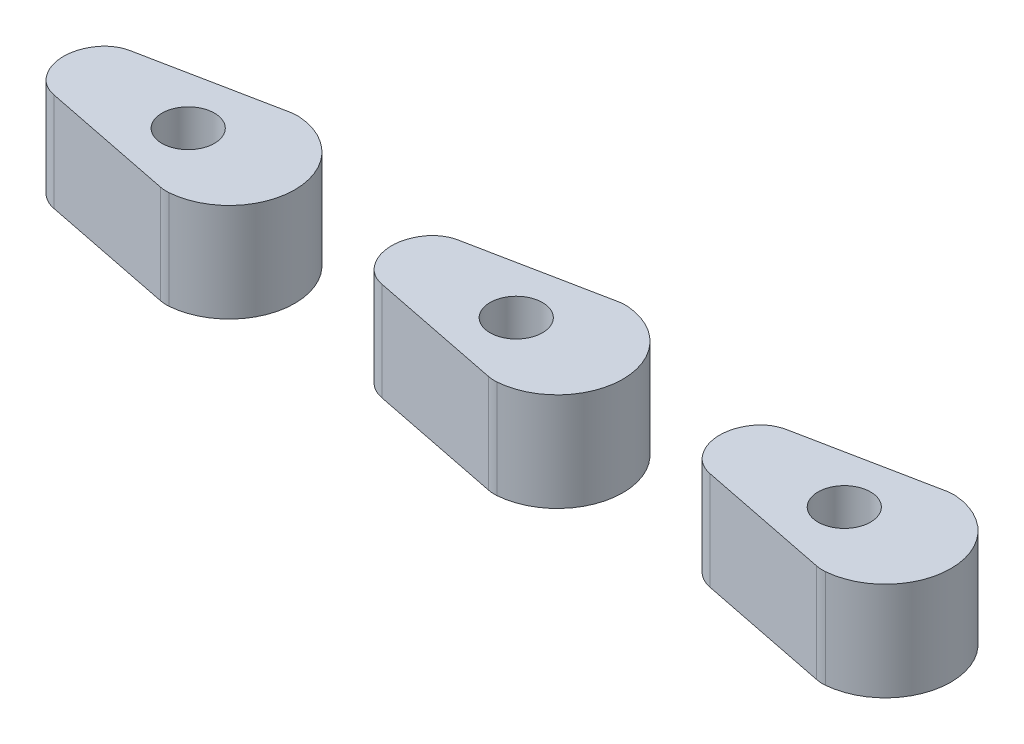
ISO-10303-21;
HEADER;
FILE_DESCRIPTION(('STEP AP214'),'2;1');
FILE_NAME('part.step','',(''),(''),'','','');
FILE_SCHEMA(('AUTOMOTIVE_DESIGN { 1 0 10303 214 1 1 1 1 }'));
ENDSEC;
DATA;
#1=APPLICATION_CONTEXT('core data for automotive mechanical design processes');
#2=APPLICATION_PROTOCOL_DEFINITION('international standard','automotive_design',2000,#1);
#3=PRODUCT_CONTEXT('',#1,'mechanical');
#4=PRODUCT('Part','Part','',(#3));
#5=PRODUCT_RELATED_PRODUCT_CATEGORY('part','',(#4));
#6=PRODUCT_DEFINITION_FORMATION('','',#4);
#7=PRODUCT_DEFINITION_CONTEXT('part definition',#1,'design');
#8=PRODUCT_DEFINITION('design','',#6,#7);
#9=PRODUCT_DEFINITION_SHAPE('','',#8);
#10=(LENGTH_UNIT() NAMED_UNIT(*) SI_UNIT(.MILLI.,.METRE.));
#11=(NAMED_UNIT(*) PLANE_ANGLE_UNIT() SI_UNIT($,.RADIAN.));
#12=(NAMED_UNIT(*) SI_UNIT($,.STERADIAN.) SOLID_ANGLE_UNIT());
#13=UNCERTAINTY_MEASURE_WITH_UNIT(LENGTH_MEASURE(1.E-05),#10,'distance_accuracy_value','');
#14=(GEOMETRIC_REPRESENTATION_CONTEXT(3) GLOBAL_UNCERTAINTY_ASSIGNED_CONTEXT((#13)) GLOBAL_UNIT_ASSIGNED_CONTEXT((#10,
#11,#12)) REPRESENTATION_CONTEXT('',''));
#15=CARTESIAN_POINT('',(0.,0.,0.));
#16=DIRECTION('',(0.,0.,1.));
#17=DIRECTION('',(1.,0.,0.));
#18=AXIS2_PLACEMENT_3D('',#15,#16,#17);
#19=CARTESIAN_POINT('',(-23.75,3.,0.));
#20=DIRECTION('',(0.,-1.,0.));
#21=DIRECTION('',(0.,0.,-1.));
#22=AXIS2_PLACEMENT_3D('',#19,#20,#21);
#23=CYLINDRICAL_SURFACE('',#22,1.3);
#24=CARTESIAN_POINT('',(-23.75,0.,0.));
#25=DIRECTION('',(0.,1.,0.));
#26=DIRECTION('',(0.,0.,1.));
#27=AXIS2_PLACEMENT_3D('',#24,#25,#26);
#28=CIRCLE('',#27,1.3);
#29=CARTESIAN_POINT('',(-24.7783064196765,0.,-0.795352693622207));
#30=VERTEX_POINT('',#29);
#31=CARTESIAN_POINT('',(-24.7783064196765,0.,0.795352693622255));
#32=VERTEX_POINT('',#31);
#33=EDGE_CURVE('E146',#30,#32,#28,.T.);
#34=ORIENTED_EDGE('',*,*,#33,.T.);
#35=DIRECTION('',(0.,-1.,0.));
#36=VECTOR('',#35,1.);
#37=CARTESIAN_POINT('',(-24.7783064196765,3.,0.795352693622255));
#38=LINE('',#37,#36);
#39=CARTESIAN_POINT('',(-24.7783064196765,3.,0.795352693622255));
#40=VERTEX_POINT('',#39);
#41=EDGE_CURVE('E12',#40,#32,#38,.T.);
#42=ORIENTED_EDGE('',*,*,#41,.F.);
#43=CARTESIAN_POINT('',(-23.75,3.,0.));
#44=DIRECTION('',(0.,1.,0.));
#45=DIRECTION('',(0.,0.,1.));
#46=AXIS2_PLACEMENT_3D('',#43,#44,#45);
#47=CIRCLE('',#46,1.3);
#48=CARTESIAN_POINT('',(-24.7783064196765,3.,-0.795352693622207));
#49=VERTEX_POINT('',#48);
#50=EDGE_CURVE('E104',#49,#40,#47,.T.);
#51=ORIENTED_EDGE('',*,*,#50,.F.);
#52=DIRECTION('',(0.,-1.,0.));
#53=VECTOR('',#52,1.);
#54=CARTESIAN_POINT('',(-24.7783064196765,3.,-0.795352693622207));
#55=LINE('',#54,#53);
#56=EDGE_CURVE('E145',#49,#30,#55,.T.);
#57=ORIENTED_EDGE('',*,*,#56,.T.);
#58=EDGE_LOOP('',(#34,#42,#51,#57));
#59=FACE_BOUND('',#58,.T.);
#60=ADVANCED_FACE('F48',(#59),#23,.T.);
#61=CARTESIAN_POINT('',(-23.9873014814638,3.,0.183542929297462));
#62=DIRECTION('',(0.,-1.,0.));
#63=DIRECTION('',(0.,0.,-1.));
#64=AXIS2_PLACEMENT_3D('',#61,#62,#63);
#65=CYLINDRICAL_SURFACE('',#64,1.);
#66=CARTESIAN_POINT('',(-23.9873014814638,0.,0.183542929297462));
#67=DIRECTION('',(0.,1.,0.));
#68=DIRECTION('',(0.,0.,1.));
#69=AXIS2_PLACEMENT_3D('',#66,#67,#68);
#70=CIRCLE('',#69,1.);
#71=CARTESIAN_POINT('',(-24.183235690524,0.,1.16415997265331));
#72=VERTEX_POINT('',#71);
#73=EDGE_CURVE('E149',#72,#32,#70,.F.);
#74=ORIENTED_EDGE('',*,*,#73,.F.);
#75=DIRECTION('',(0.,-1.,0.));
#76=VECTOR('',#75,1.);
#77=CARTESIAN_POINT('',(-24.183235690524,3.,1.16415997265331));
#78=LINE('',#77,#76);
#79=CARTESIAN_POINT('',(-24.183235690524,3.,1.16415997265331));
#80=VERTEX_POINT('',#79);
#81=EDGE_CURVE('E56',#80,#72,#78,.T.);
#82=ORIENTED_EDGE('',*,*,#81,.F.);
#83=CARTESIAN_POINT('',(-23.9873014814638,3.,0.183542929297462));
#84=DIRECTION('',(0.,1.,0.));
#85=DIRECTION('',(0.,0.,1.));
#86=AXIS2_PLACEMENT_3D('',#83,#84,#85);
#87=CIRCLE('',#86,1.);
#88=EDGE_CURVE('E195',#80,#40,#87,.F.);
#89=ORIENTED_EDGE('',*,*,#88,.T.);
#90=ORIENTED_EDGE('',*,*,#41,.T.);
#91=EDGE_LOOP('',(#74,#82,#89,#90));
#92=FACE_BOUND('',#91,.T.);
#93=ADVANCED_FACE('F182',(#92),#65,.T.);
#94=CARTESIAN_POINT('',(-20.3842728495618,3.,1.92321957143993));
#95=DIRECTION('',(-0.195934209060197,0.,0.980617043355843));
#96=DIRECTION('',(0.980617043355843,0.,0.195934209060197));
#97=AXIS2_PLACEMENT_3D('',#94,#95,#96);
#98=PLANE('',#97);
#99=DIRECTION('',(-0.980617043355843,0.,-0.195934209060197));
#100=VECTOR('',#99,1.);
#101=CARTESIAN_POINT('',(-20.3842728495618,0.,1.92321957143993));
#102=LINE('',#101,#100);
#103=CARTESIAN_POINT('',(-20.1138837599714,0.,1.9772452206639));
#104=VERTEX_POINT('',#103);
#105=EDGE_CURVE('E152',#104,#72,#102,.T.);
#106=ORIENTED_EDGE('',*,*,#105,.F.);
#107=DIRECTION('',(0.,-1.,0.));
#108=VECTOR('',#107,1.);
#109=CARTESIAN_POINT('',(-20.1138837599714,3.,1.9772452206639));
#110=LINE('',#109,#108);
#111=CARTESIAN_POINT('',(-20.1138837599714,3.,1.9772452206639));
#112=VERTEX_POINT('',#111);
#113=EDGE_CURVE('E172',#112,#104,#110,.T.);
#114=ORIENTED_EDGE('',*,*,#113,.F.);
#115=DIRECTION('',(-0.980617043355843,0.,-0.195934209060197));
#116=VECTOR('',#115,1.);
#117=CARTESIAN_POINT('',(-20.3842728495618,3.,1.92321957143993));
#118=LINE('',#117,#116);
#119=EDGE_CURVE('E179',#112,#80,#118,.T.);
#120=ORIENTED_EDGE('',*,*,#119,.T.);
#121=ORIENTED_EDGE('',*,*,#81,.T.);
#122=EDGE_LOOP('',(#106,#114,#120,#121));
#123=FACE_BOUND('',#122,.T.);
#124=ADVANCED_FACE('F177',(#123),#98,.T.);
#125=CARTESIAN_POINT('',(-19.9179495509112,3.,0.996628177308058));
#126=DIRECTION('',(0.,-1.,0.));
#127=DIRECTION('',(0.,0.,-1.));
#128=AXIS2_PLACEMENT_3D('',#125,#126,#127);
#129=CYLINDRICAL_SURFACE('',#128,1.);
#130=CARTESIAN_POINT('',(-19.9179495509112,0.,0.996628177308058));
#131=DIRECTION('',(0.,1.,0.));
#132=DIRECTION('',(0.,0.,1.));
#133=AXIS2_PLACEMENT_3D('',#130,#131,#132);
#134=CIRCLE('',#133,1.);
#135=CARTESIAN_POINT('',(-19.8358991018225,0.,1.99325635461609));
#136=VERTEX_POINT('',#135);
#137=EDGE_CURVE('E155',#104,#136,#134,.T.);
#138=ORIENTED_EDGE('',*,*,#137,.T.);
#139=DIRECTION('',(0.,-1.,0.));
#140=VECTOR('',#139,1.);
#141=CARTESIAN_POINT('',(-19.8358991018225,3.,1.99325635461609));
#142=LINE('',#141,#140);
#143=CARTESIAN_POINT('',(-19.8358991018225,3.,1.99325635461609));
#144=VERTEX_POINT('',#143);
#145=EDGE_CURVE('E170',#144,#136,#142,.T.);
#146=ORIENTED_EDGE('',*,*,#145,.F.);
#147=CARTESIAN_POINT('',(-19.9179495509112,3.,0.996628177308058));
#148=DIRECTION('',(0.,1.,0.));
#149=DIRECTION('',(0.,0.,1.));
#150=AXIS2_PLACEMENT_3D('',#147,#148,#149);
#151=CIRCLE('',#150,1.);
#152=EDGE_CURVE('E193',#112,#144,#151,.T.);
#153=ORIENTED_EDGE('',*,*,#152,.F.);
#154=ORIENTED_EDGE('',*,*,#113,.T.);
#155=EDGE_LOOP('',(#138,#146,#153,#154));
#156=FACE_BOUND('',#155,.T.);
#157=ADVANCED_FACE('F191',(#156),#129,.T.);
#158=CARTESIAN_POINT('',(-20.0000000000106,3.,-1.28522085902486E-10));
#159=DIRECTION('',(0.,-1.,0.));
#160=DIRECTION('',(0.,0.,-1.));
#161=AXIS2_PLACEMENT_3D('',#158,#159,#160);
#162=CYLINDRICAL_SURFACE('',#161,2.00000000012898);
#163=CARTESIAN_POINT('',(-20.0000000000106,0.,-1.28522085902486E-10));
#164=DIRECTION('',(0.,1.,0.));
#165=DIRECTION('',(0.,0.,1.));
#166=AXIS2_PLACEMENT_3D('',#163,#164,#165);
#167=CIRCLE('',#166,2.00000000012898);
#168=CARTESIAN_POINT('',(-19.8358991,0.,-1.99325635472309));
#169=VERTEX_POINT('',#168);
#170=EDGE_CURVE('E158',#169,#136,#167,.F.);
#171=ORIENTED_EDGE('',*,*,#170,.F.);
#172=DIRECTION('',(0.,-1.,0.));
#173=VECTOR('',#172,1.);
#174=CARTESIAN_POINT('',(-19.8358991,3.,-1.99325635472309));
#175=LINE('',#174,#173);
#176=CARTESIAN_POINT('',(-19.8358991,3.,-1.99325635472309));
#177=VERTEX_POINT('',#176);
#178=EDGE_CURVE('E134',#177,#169,#175,.T.);
#179=ORIENTED_EDGE('',*,*,#178,.F.);
#180=CARTESIAN_POINT('',(-20.0000000000106,3.,-1.28522085902486E-10));
#181=DIRECTION('',(0.,1.,0.));
#182=DIRECTION('',(0.,0.,1.));
#183=AXIS2_PLACEMENT_3D('',#180,#181,#182);
#184=CIRCLE('',#183,2.00000000012898);
#185=EDGE_CURVE('E127',#177,#144,#184,.F.);
#186=ORIENTED_EDGE('',*,*,#185,.T.);
#187=ORIENTED_EDGE('',*,*,#145,.T.);
#188=EDGE_LOOP('',(#171,#179,#186,#187));
#189=FACE_BOUND('',#188,.T.);
#190=ADVANCED_FACE('F200',(#189),#162,.T.);
#191=CARTESIAN_POINT('',(-19.91794955,3.,-0.996628177490081));
#192=DIRECTION('',(0.,-1.,0.));
#193=DIRECTION('',(0.,0.,-1.));
#194=AXIS2_PLACEMENT_3D('',#191,#192,#193);
#195=CYLINDRICAL_SURFACE('',#194,1.);
#196=CARTESIAN_POINT('',(-19.91794955,0.,-0.996628177490081));
#197=DIRECTION('',(0.,1.,0.));
#198=DIRECTION('',(0.,0.,1.));
#199=AXIS2_PLACEMENT_3D('',#196,#197,#198);
#200=CIRCLE('',#199,1.);
#201=CARTESIAN_POINT('',(-20.1138837590602,0.,-1.97724522084592));
#202=VERTEX_POINT('',#201);
#203=EDGE_CURVE('E133',#169,#202,#200,.T.);
#204=ORIENTED_EDGE('',*,*,#203,.T.);
#205=DIRECTION('',(0.,-1.,0.));
#206=VECTOR('',#205,1.);
#207=CARTESIAN_POINT('',(-20.1138837590602,3.,-1.97724522084592));
#208=LINE('',#207,#206);
#209=CARTESIAN_POINT('',(-20.1138837590602,3.,-1.97724522084592));
#210=VERTEX_POINT('',#209);
#211=EDGE_CURVE('E130',#210,#202,#208,.T.);
#212=ORIENTED_EDGE('',*,*,#211,.F.);
#213=CARTESIAN_POINT('',(-19.91794955,3.,-0.996628177490081));
#214=DIRECTION('',(0.,1.,0.));
#215=DIRECTION('',(0.,0.,1.));
#216=AXIS2_PLACEMENT_3D('',#213,#214,#215);
#217=CIRCLE('',#216,1.);
#218=EDGE_CURVE('E120',#177,#210,#217,.T.);
#219=ORIENTED_EDGE('',*,*,#218,.F.);
#220=ORIENTED_EDGE('',*,*,#178,.T.);
#221=EDGE_LOOP('',(#204,#212,#219,#220));
#222=FACE_BOUND('',#221,.T.);
#223=ADVANCED_FACE('F131',(#222),#195,.T.);
#224=CARTESIAN_POINT('',(-20.3842728495618,3.,-1.92321957143989));
#225=DIRECTION('',(0.195934209060197,0.,0.980617043355843));
#226=DIRECTION('',(0.980617043355843,0.,-0.195934209060197));
#227=AXIS2_PLACEMENT_3D('',#224,#225,#226);
#228=PLANE('',#227);
#229=DIRECTION('',(-0.980617043355843,0.,0.195934209060197));
#230=VECTOR('',#229,1.);
#231=CARTESIAN_POINT('',(-20.3842728495618,0.,-1.92321957143989));
#232=LINE('',#231,#230);
#233=CARTESIAN_POINT('',(-24.183235690524,0.,-1.16415997265326));
#234=VERTEX_POINT('',#233);
#235=EDGE_CURVE('E92',#202,#234,#232,.T.);
#236=ORIENTED_EDGE('',*,*,#235,.T.);
#237=DIRECTION('',(0.,-1.,0.));
#238=VECTOR('',#237,1.);
#239=CARTESIAN_POINT('',(-24.183235690524,3.,-1.16415997265326));
#240=LINE('',#239,#238);
#241=CARTESIAN_POINT('',(-24.183235690524,3.,-1.16415997265326));
#242=VERTEX_POINT('',#241);
#243=EDGE_CURVE('E135',#242,#234,#240,.T.);
#244=ORIENTED_EDGE('',*,*,#243,.F.);
#245=DIRECTION('',(-0.980617043355843,0.,0.195934209060197));
#246=VECTOR('',#245,1.);
#247=CARTESIAN_POINT('',(-20.3842728495618,3.,-1.92321957143989));
#248=LINE('',#247,#246);
#249=EDGE_CURVE('E125',#210,#242,#248,.T.);
#250=ORIENTED_EDGE('',*,*,#249,.F.);
#251=ORIENTED_EDGE('',*,*,#211,.T.);
#252=EDGE_LOOP('',(#236,#244,#250,#251));
#253=FACE_BOUND('',#252,.T.);
#254=ADVANCED_FACE('F137',(#253),#228,.F.);
#255=CARTESIAN_POINT('',(-23.9873014814638,3.,-0.183542929297414));
#256=DIRECTION('',(0.,-1.,0.));
#257=DIRECTION('',(0.,0.,-1.));
#258=AXIS2_PLACEMENT_3D('',#255,#256,#257);
#259=CYLINDRICAL_SURFACE('',#258,1.);
#260=CARTESIAN_POINT('',(-23.9873014814638,0.,-0.183542929297414));
#261=DIRECTION('',(0.,1.,0.));
#262=DIRECTION('',(0.,0.,1.));
#263=AXIS2_PLACEMENT_3D('',#260,#261,#262);
#264=CIRCLE('',#263,1.);
#265=EDGE_CURVE('E98',#234,#30,#264,.T.);
#266=ORIENTED_EDGE('',*,*,#265,.T.);
#267=ORIENTED_EDGE('',*,*,#56,.F.);
#268=CARTESIAN_POINT('',(-23.9873014814638,3.,-0.183542929297414));
#269=DIRECTION('',(0.,1.,0.));
#270=DIRECTION('',(0.,0.,1.));
#271=AXIS2_PLACEMENT_3D('',#268,#269,#270);
#272=CIRCLE('',#271,1.);
#273=EDGE_CURVE('E64',#242,#49,#272,.T.);
#274=ORIENTED_EDGE('',*,*,#273,.F.);
#275=ORIENTED_EDGE('',*,*,#243,.T.);
#276=EDGE_LOOP('',(#266,#267,#274,#275));
#277=FACE_BOUND('',#276,.T.);
#278=ADVANCED_FACE('F202',(#277),#259,.T.);
#279=CARTESIAN_POINT('',(-21.2499999999997,3.,0.));
#280=DIRECTION('',(0.,-1.,0.));
#281=DIRECTION('',(0.,0.,-1.));
#282=AXIS2_PLACEMENT_3D('',#279,#280,#281);
#283=CYLINDRICAL_SURFACE('',#282,0.8);
#284=CARTESIAN_POINT('',(-21.2499999999997,3.,0.));
#285=DIRECTION('',(0.,1.,0.));
#286=DIRECTION('',(0.,0.,1.));
#287=AXIS2_PLACEMENT_3D('',#284,#285,#286);
#288=CIRCLE('',#287,0.8);
#289=CARTESIAN_POINT('',(-21.2499999999997,3.,0.800000000000018));
#290=VERTEX_POINT('',#289);
#291=EDGE_CURVE('E139',#290,#290,#288,.T.);
#292=ORIENTED_EDGE('',*,*,#291,.T.);
#293=EDGE_LOOP('',(#292));
#294=FACE_BOUND('',#293,.T.);
#295=CARTESIAN_POINT('',(-21.2499999999997,0.,0.));
#296=DIRECTION('',(0.,1.,0.));
#297=DIRECTION('',(0.,0.,1.));
#298=AXIS2_PLACEMENT_3D('',#295,#296,#297);
#299=CIRCLE('',#298,0.8);
#300=CARTESIAN_POINT('',(-21.2499999999997,0.,0.800000000000018));
#301=VERTEX_POINT('',#300);
#302=EDGE_CURVE('E164',#301,#301,#299,.T.);
#303=ORIENTED_EDGE('',*,*,#302,.F.);
#304=EDGE_LOOP('',(#303));
#305=FACE_BOUND('',#304,.T.);
#306=ADVANCED_FACE('F204',(#294,#305),#283,.F.);
#307=CARTESIAN_POINT('',(-20.,3.,0.));
#308=DIRECTION('',(0.,1.,0.));
#309=DIRECTION('',(0.,0.,1.));
#310=AXIS2_PLACEMENT_3D('',#307,#308,#309);
#311=PLANE('',#310);
#312=ORIENTED_EDGE('',*,*,#50,.T.);
#313=ORIENTED_EDGE('',*,*,#88,.F.);
#314=ORIENTED_EDGE('',*,*,#119,.F.);
#315=ORIENTED_EDGE('',*,*,#152,.T.);
#316=ORIENTED_EDGE('',*,*,#185,.F.);
#317=ORIENTED_EDGE('',*,*,#218,.T.);
#318=ORIENTED_EDGE('',*,*,#249,.T.);
#319=ORIENTED_EDGE('',*,*,#273,.T.);
#320=EDGE_LOOP('',(#312,#313,#314,#315,#316,#317,#318,#319));
#321=FACE_BOUND('',#320,.T.);
#322=ORIENTED_EDGE('',*,*,#291,.F.);
#323=EDGE_LOOP('',(#322));
#324=FACE_BOUND('',#323,.T.);
#325=ADVANCED_FACE('F122',(#321,#324),#311,.T.);
#326=CARTESIAN_POINT('',(-20.,0.,0.));
#327=DIRECTION('',(0.,1.,0.));
#328=DIRECTION('',(0.,0.,1.));
#329=AXIS2_PLACEMENT_3D('',#326,#327,#328);
#330=PLANE('',#329);
#331=ORIENTED_EDGE('',*,*,#33,.F.);
#332=ORIENTED_EDGE('',*,*,#265,.F.);
#333=ORIENTED_EDGE('',*,*,#235,.F.);
#334=ORIENTED_EDGE('',*,*,#203,.F.);
#335=ORIENTED_EDGE('',*,*,#170,.T.);
#336=ORIENTED_EDGE('',*,*,#137,.F.);
#337=ORIENTED_EDGE('',*,*,#105,.T.);
#338=ORIENTED_EDGE('',*,*,#73,.T.);
#339=EDGE_LOOP('',(#331,#332,#333,#334,#335,#336,#337,#338));
#340=FACE_BOUND('',#339,.T.);
#341=ORIENTED_EDGE('',*,*,#302,.T.);
#342=EDGE_LOOP('',(#341));
#343=FACE_BOUND('',#342,.T.);
#344=ADVANCED_FACE('F186',(#340,#343),#330,.F.);
#345=CLOSED_SHELL('',(#60,#93,#124,#157,#190,#223,#254,#278,#306,#325,#344));
#346=MANIFOLD_SOLID_BREP('B2',#345);
#347=CARTESIAN_POINT('',(-13.75,3.,0.));
#348=DIRECTION('',(0.,-1.,0.));
#349=DIRECTION('',(0.,0.,-1.));
#350=AXIS2_PLACEMENT_3D('',#347,#348,#349);
#351=CYLINDRICAL_SURFACE('',#350,1.3);
#352=CARTESIAN_POINT('',(-13.75,0.,0.));
#353=DIRECTION('',(0.,1.,0.));
#354=DIRECTION('',(0.,0.,1.));
#355=AXIS2_PLACEMENT_3D('',#352,#353,#354);
#356=CIRCLE('',#355,1.3);
#357=CARTESIAN_POINT('',(-14.7783064196765,0.,-0.795352693622219));
#358=VERTEX_POINT('',#357);
#359=CARTESIAN_POINT('',(-14.7783064196765,0.,0.795352693622243));
#360=VERTEX_POINT('',#359);
#361=EDGE_CURVE('E418',#358,#360,#356,.T.);
#362=ORIENTED_EDGE('',*,*,#361,.T.);
#363=DIRECTION('',(0.,-1.,0.));
#364=VECTOR('',#363,1.);
#365=CARTESIAN_POINT('',(-14.7783064196765,3.,0.795352693622243));
#366=LINE('',#365,#364);
#367=CARTESIAN_POINT('',(-14.7783064196765,3.,0.795352693622243));
#368=VERTEX_POINT('',#367);
#369=EDGE_CURVE('E46',#368,#360,#366,.T.);
#370=ORIENTED_EDGE('',*,*,#369,.F.);
#371=CARTESIAN_POINT('',(-13.75,3.,0.));
#372=DIRECTION('',(0.,1.,0.));
#373=DIRECTION('',(0.,0.,1.));
#374=AXIS2_PLACEMENT_3D('',#371,#372,#373);
#375=CIRCLE('',#374,1.3);
#376=CARTESIAN_POINT('',(-14.7783064196765,3.,-0.795352693622219));
#377=VERTEX_POINT('',#376);
#378=EDGE_CURVE('E376',#377,#368,#375,.T.);
#379=ORIENTED_EDGE('',*,*,#378,.F.);
#380=DIRECTION('',(0.,-1.,0.));
#381=VECTOR('',#380,1.);
#382=CARTESIAN_POINT('',(-14.7783064196765,3.,-0.795352693622219));
#383=LINE('',#382,#381);
#384=EDGE_CURVE('E417',#377,#358,#383,.T.);
#385=ORIENTED_EDGE('',*,*,#384,.T.);
#386=EDGE_LOOP('',(#362,#370,#379,#385));
#387=FACE_BOUND('',#386,.T.);
#388=ADVANCED_FACE('F320',(#387),#351,.T.);
#389=CARTESIAN_POINT('',(-13.9873014814638,3.,0.18354292929745));
#390=DIRECTION('',(0.,-1.,0.));
#391=DIRECTION('',(0.,0.,-1.));
#392=AXIS2_PLACEMENT_3D('',#389,#390,#391);
#393=CYLINDRICAL_SURFACE('',#392,1.);
#394=CARTESIAN_POINT('',(-13.9873014814638,0.,0.18354292929745));
#395=DIRECTION('',(0.,1.,0.));
#396=DIRECTION('',(0.,0.,1.));
#397=AXIS2_PLACEMENT_3D('',#394,#395,#396);
#398=CIRCLE('',#397,1.);
#399=CARTESIAN_POINT('',(-14.183235690524,0.,1.16415997265329));
#400=VERTEX_POINT('',#399);
#401=EDGE_CURVE('E421',#400,#360,#398,.F.);
#402=ORIENTED_EDGE('',*,*,#401,.F.);
#403=DIRECTION('',(0.,-1.,0.));
#404=VECTOR('',#403,1.);
#405=CARTESIAN_POINT('',(-14.183235690524,3.,1.16415997265329));
#406=LINE('',#405,#404);
#407=CARTESIAN_POINT('',(-14.183235690524,3.,1.16415997265329));
#408=VERTEX_POINT('',#407);
#409=EDGE_CURVE('E328',#408,#400,#406,.T.);
#410=ORIENTED_EDGE('',*,*,#409,.F.);
#411=CARTESIAN_POINT('',(-13.9873014814638,3.,0.18354292929745));
#412=DIRECTION('',(0.,1.,0.));
#413=DIRECTION('',(0.,0.,1.));
#414=AXIS2_PLACEMENT_3D('',#411,#412,#413);
#415=CIRCLE('',#414,1.);
#416=EDGE_CURVE('E467',#408,#368,#415,.F.);
#417=ORIENTED_EDGE('',*,*,#416,.T.);
#418=ORIENTED_EDGE('',*,*,#369,.T.);
#419=EDGE_LOOP('',(#402,#410,#417,#418));
#420=FACE_BOUND('',#419,.T.);
#421=ADVANCED_FACE('F454',(#420),#393,.T.);
#422=CARTESIAN_POINT('',(-10.3842728495618,3.,1.92321957143992));
#423=DIRECTION('',(-0.195934209060197,0.,0.980617043355843));
#424=DIRECTION('',(0.980617043355843,0.,0.195934209060197));
#425=AXIS2_PLACEMENT_3D('',#422,#423,#424);
#426=PLANE('',#425);
#427=DIRECTION('',(-0.980617043355843,0.,-0.195934209060197));
#428=VECTOR('',#427,1.);
#429=CARTESIAN_POINT('',(-10.3842728495618,0.,1.92321957143992));
#430=LINE('',#429,#428);
#431=CARTESIAN_POINT('',(-10.1138837599714,0.,1.97724522066389));
#432=VERTEX_POINT('',#431);
#433=EDGE_CURVE('E424',#432,#400,#430,.T.);
#434=ORIENTED_EDGE('',*,*,#433,.F.);
#435=DIRECTION('',(0.,-1.,0.));
#436=VECTOR('',#435,1.);
#437=CARTESIAN_POINT('',(-10.1138837599714,3.,1.97724522066389));
#438=LINE('',#437,#436);
#439=CARTESIAN_POINT('',(-10.1138837599714,3.,1.97724522066389));
#440=VERTEX_POINT('',#439);
#441=EDGE_CURVE('E444',#440,#432,#438,.T.);
#442=ORIENTED_EDGE('',*,*,#441,.F.);
#443=DIRECTION('',(-0.980617043355843,0.,-0.195934209060197));
#444=VECTOR('',#443,1.);
#445=CARTESIAN_POINT('',(-10.3842728495618,3.,1.92321957143992));
#446=LINE('',#445,#444);
#447=EDGE_CURVE('E451',#440,#408,#446,.T.);
#448=ORIENTED_EDGE('',*,*,#447,.T.);
#449=ORIENTED_EDGE('',*,*,#409,.T.);
#450=EDGE_LOOP('',(#434,#442,#448,#449));
#451=FACE_BOUND('',#450,.T.);
#452=ADVANCED_FACE('F449',(#451),#426,.T.);
#453=CARTESIAN_POINT('',(-9.91794955091124,3.,0.996628177308046));
#454=DIRECTION('',(0.,-1.,0.));
#455=DIRECTION('',(0.,0.,-1.));
#456=AXIS2_PLACEMENT_3D('',#453,#454,#455);
#457=CYLINDRICAL_SURFACE('',#456,1.);
#458=CARTESIAN_POINT('',(-9.91794955091124,0.,0.996628177308046));
#459=DIRECTION('',(0.,1.,0.));
#460=DIRECTION('',(0.,0.,1.));
#461=AXIS2_PLACEMENT_3D('',#458,#459,#460);
#462=CIRCLE('',#461,1.);
#463=CARTESIAN_POINT('',(-9.83589910182248,0.,1.99325635461608));
#464=VERTEX_POINT('',#463);
#465=EDGE_CURVE('E427',#432,#464,#462,.T.);
#466=ORIENTED_EDGE('',*,*,#465,.T.);
#467=DIRECTION('',(0.,-1.,0.));
#468=VECTOR('',#467,1.);
#469=CARTESIAN_POINT('',(-9.83589910182248,3.,1.99325635461608));
#470=LINE('',#469,#468);
#471=CARTESIAN_POINT('',(-9.83589910182248,3.,1.99325635461608));
#472=VERTEX_POINT('',#471);
#473=EDGE_CURVE('E442',#472,#464,#470,.T.);
#474=ORIENTED_EDGE('',*,*,#473,.F.);
#475=CARTESIAN_POINT('',(-9.91794955091124,3.,0.996628177308046));
#476=DIRECTION('',(0.,1.,0.));
#477=DIRECTION('',(0.,0.,1.));
#478=AXIS2_PLACEMENT_3D('',#475,#476,#477);
#479=CIRCLE('',#478,1.);
#480=EDGE_CURVE('E465',#440,#472,#479,.T.);
#481=ORIENTED_EDGE('',*,*,#480,.F.);
#482=ORIENTED_EDGE('',*,*,#441,.T.);
#483=EDGE_LOOP('',(#466,#474,#481,#482));
#484=FACE_BOUND('',#483,.T.);
#485=ADVANCED_FACE('F463',(#484),#457,.T.);
#486=CARTESIAN_POINT('',(-10.0000000000106,3.,-1.28534228249551E-10));
#487=DIRECTION('',(0.,-1.,0.));
#488=DIRECTION('',(0.,0.,-1.));
#489=AXIS2_PLACEMENT_3D('',#486,#487,#488);
#490=CYLINDRICAL_SURFACE('',#489,2.00000000012898);
#491=CARTESIAN_POINT('',(-10.0000000000106,0.,-1.28534228249551E-10));
#492=DIRECTION('',(0.,1.,0.));
#493=DIRECTION('',(0.,0.,1.));
#494=AXIS2_PLACEMENT_3D('',#491,#492,#493);
#495=CIRCLE('',#494,2.00000000012898);
#496=CARTESIAN_POINT('',(-9.8358991,0.,-1.99325635472311));
#497=VERTEX_POINT('',#496);
#498=EDGE_CURVE('E430',#497,#464,#495,.F.);
#499=ORIENTED_EDGE('',*,*,#498,.F.);
#500=DIRECTION('',(0.,-1.,0.));
#501=VECTOR('',#500,1.);
#502=CARTESIAN_POINT('',(-9.8358991,3.,-1.99325635472311));
#503=LINE('',#502,#501);
#504=CARTESIAN_POINT('',(-9.8358991,3.,-1.99325635472311));
#505=VERTEX_POINT('',#504);
#506=EDGE_CURVE('E406',#505,#497,#503,.T.);
#507=ORIENTED_EDGE('',*,*,#506,.F.);
#508=CARTESIAN_POINT('',(-10.0000000000106,3.,-1.28534228249551E-10));
#509=DIRECTION('',(0.,1.,0.));
#510=DIRECTION('',(0.,0.,1.));
#511=AXIS2_PLACEMENT_3D('',#508,#509,#510);
#512=CIRCLE('',#511,2.00000000012898);
#513=EDGE_CURVE('E399',#505,#472,#512,.F.);
#514=ORIENTED_EDGE('',*,*,#513,.T.);
#515=ORIENTED_EDGE('',*,*,#473,.T.);
#516=EDGE_LOOP('',(#499,#507,#514,#515));
#517=FACE_BOUND('',#516,.T.);
#518=ADVANCED_FACE('F472',(#517),#490,.T.);
#519=CARTESIAN_POINT('',(-9.91794955,3.,-0.996628177490094));
#520=DIRECTION('',(0.,-1.,0.));
#521=DIRECTION('',(0.,0.,-1.));
#522=AXIS2_PLACEMENT_3D('',#519,#520,#521);
#523=CYLINDRICAL_SURFACE('',#522,1.);
#524=CARTESIAN_POINT('',(-9.91794955,0.,-0.996628177490094));
#525=DIRECTION('',(0.,1.,0.));
#526=DIRECTION('',(0.,0.,1.));
#527=AXIS2_PLACEMENT_3D('',#524,#525,#526);
#528=CIRCLE('',#527,1.);
#529=CARTESIAN_POINT('',(-10.1138837590602,0.,-1.97724522084594));
#530=VERTEX_POINT('',#529);
#531=EDGE_CURVE('E405',#497,#530,#528,.T.);
#532=ORIENTED_EDGE('',*,*,#531,.T.);
#533=DIRECTION('',(0.,-1.,0.));
#534=VECTOR('',#533,1.);
#535=CARTESIAN_POINT('',(-10.1138837590602,3.,-1.97724522084594));
#536=LINE('',#535,#534);
#537=CARTESIAN_POINT('',(-10.1138837590602,3.,-1.97724522084594));
#538=VERTEX_POINT('',#537);
#539=EDGE_CURVE('E402',#538,#530,#536,.T.);
#540=ORIENTED_EDGE('',*,*,#539,.F.);
#541=CARTESIAN_POINT('',(-9.91794955,3.,-0.996628177490094));
#542=DIRECTION('',(0.,1.,0.));
#543=DIRECTION('',(0.,0.,1.));
#544=AXIS2_PLACEMENT_3D('',#541,#542,#543);
#545=CIRCLE('',#544,1.);
#546=EDGE_CURVE('E392',#505,#538,#545,.T.);
#547=ORIENTED_EDGE('',*,*,#546,.F.);
#548=ORIENTED_EDGE('',*,*,#506,.T.);
#549=EDGE_LOOP('',(#532,#540,#547,#548));
#550=FACE_BOUND('',#549,.T.);
#551=ADVANCED_FACE('F403',(#550),#523,.T.);
#552=CARTESIAN_POINT('',(-10.3842728495618,3.,-1.9232195714399));
#553=DIRECTION('',(0.195934209060197,0.,0.980617043355843));
#554=DIRECTION('',(0.980617043355843,0.,-0.195934209060197));
#555=AXIS2_PLACEMENT_3D('',#552,#553,#554);
#556=PLANE('',#555);
#557=DIRECTION('',(-0.980617043355843,0.,0.195934209060197));
#558=VECTOR('',#557,1.);
#559=CARTESIAN_POINT('',(-10.3842728495618,0.,-1.9232195714399));
#560=LINE('',#559,#558);
#561=CARTESIAN_POINT('',(-14.183235690524,0.,-1.16415997265327));
#562=VERTEX_POINT('',#561);
#563=EDGE_CURVE('E364',#530,#562,#560,.T.);
#564=ORIENTED_EDGE('',*,*,#563,.T.);
#565=DIRECTION('',(0.,-1.,0.));
#566=VECTOR('',#565,1.);
#567=CARTESIAN_POINT('',(-14.183235690524,3.,-1.16415997265327));
#568=LINE('',#567,#566);
#569=CARTESIAN_POINT('',(-14.183235690524,3.,-1.16415997265327));
#570=VERTEX_POINT('',#569);
#571=EDGE_CURVE('E407',#570,#562,#568,.T.);
#572=ORIENTED_EDGE('',*,*,#571,.F.);
#573=DIRECTION('',(-0.980617043355843,0.,0.195934209060197));
#574=VECTOR('',#573,1.);
#575=CARTESIAN_POINT('',(-10.3842728495618,3.,-1.9232195714399));
#576=LINE('',#575,#574);
#577=EDGE_CURVE('E397',#538,#570,#576,.T.);
#578=ORIENTED_EDGE('',*,*,#577,.F.);
#579=ORIENTED_EDGE('',*,*,#539,.T.);
#580=EDGE_LOOP('',(#564,#572,#578,#579));
#581=FACE_BOUND('',#580,.T.);
#582=ADVANCED_FACE('F409',(#581),#556,.F.);
#583=CARTESIAN_POINT('',(-13.9873014814638,3.,-0.183542929297426));
#584=DIRECTION('',(0.,-1.,0.));
#585=DIRECTION('',(0.,0.,-1.));
#586=AXIS2_PLACEMENT_3D('',#583,#584,#585);
#587=CYLINDRICAL_SURFACE('',#586,1.);
#588=CARTESIAN_POINT('',(-13.9873014814638,0.,-0.183542929297426));
#589=DIRECTION('',(0.,1.,0.));
#590=DIRECTION('',(0.,0.,1.));
#591=AXIS2_PLACEMENT_3D('',#588,#589,#590);
#592=CIRCLE('',#591,1.);
#593=EDGE_CURVE('E370',#562,#358,#592,.T.);
#594=ORIENTED_EDGE('',*,*,#593,.T.);
#595=ORIENTED_EDGE('',*,*,#384,.F.);
#596=CARTESIAN_POINT('',(-13.9873014814638,3.,-0.183542929297426));
#597=DIRECTION('',(0.,1.,0.));
#598=DIRECTION('',(0.,0.,1.));
#599=AXIS2_PLACEMENT_3D('',#596,#597,#598);
#600=CIRCLE('',#599,1.);
#601=EDGE_CURVE('E336',#570,#377,#600,.T.);
#602=ORIENTED_EDGE('',*,*,#601,.F.);
#603=ORIENTED_EDGE('',*,*,#571,.T.);
#604=EDGE_LOOP('',(#594,#595,#602,#603));
#605=FACE_BOUND('',#604,.T.);
#606=ADVANCED_FACE('F474',(#605),#587,.T.);
#607=CARTESIAN_POINT('',(-11.2499999999997,3.,0.));
#608=DIRECTION('',(0.,-1.,0.));
#609=DIRECTION('',(0.,0.,-1.));
#610=AXIS2_PLACEMENT_3D('',#607,#608,#609);
#611=CYLINDRICAL_SURFACE('',#610,0.8);
#612=CARTESIAN_POINT('',(-11.2499999999997,3.,0.));
#613=DIRECTION('',(0.,1.,0.));
#614=DIRECTION('',(0.,0.,1.));
#615=AXIS2_PLACEMENT_3D('',#612,#613,#614);
#616=CIRCLE('',#615,0.8);
#617=CARTESIAN_POINT('',(-11.2499999999997,3.,0.800000000000006));
#618=VERTEX_POINT('',#617);
#619=EDGE_CURVE('E411',#618,#618,#616,.T.);
#620=ORIENTED_EDGE('',*,*,#619,.T.);
#621=EDGE_LOOP('',(#620));
#622=FACE_BOUND('',#621,.T.);
#623=CARTESIAN_POINT('',(-11.2499999999997,0.,0.));
#624=DIRECTION('',(0.,1.,0.));
#625=DIRECTION('',(0.,0.,1.));
#626=AXIS2_PLACEMENT_3D('',#623,#624,#625);
#627=CIRCLE('',#626,0.8);
#628=CARTESIAN_POINT('',(-11.2499999999997,0.,0.800000000000006));
#629=VERTEX_POINT('',#628);
#630=EDGE_CURVE('E436',#629,#629,#627,.T.);
#631=ORIENTED_EDGE('',*,*,#630,.F.);
#632=EDGE_LOOP('',(#631));
#633=FACE_BOUND('',#632,.T.);
#634=ADVANCED_FACE('F476',(#622,#633),#611,.F.);
#635=CARTESIAN_POINT('',(-10.,3.,0.));
#636=DIRECTION('',(0.,1.,0.));
#637=DIRECTION('',(0.,0.,1.));
#638=AXIS2_PLACEMENT_3D('',#635,#636,#637);
#639=PLANE('',#638);
#640=ORIENTED_EDGE('',*,*,#378,.T.);
#641=ORIENTED_EDGE('',*,*,#416,.F.);
#642=ORIENTED_EDGE('',*,*,#447,.F.);
#643=ORIENTED_EDGE('',*,*,#480,.T.);
#644=ORIENTED_EDGE('',*,*,#513,.F.);
#645=ORIENTED_EDGE('',*,*,#546,.T.);
#646=ORIENTED_EDGE('',*,*,#577,.T.);
#647=ORIENTED_EDGE('',*,*,#601,.T.);
#648=EDGE_LOOP('',(#640,#641,#642,#643,#644,#645,#646,#647));
#649=FACE_BOUND('',#648,.T.);
#650=ORIENTED_EDGE('',*,*,#619,.F.);
#651=EDGE_LOOP('',(#650));
#652=FACE_BOUND('',#651,.T.);
#653=ADVANCED_FACE('F394',(#649,#652),#639,.T.);
#654=CARTESIAN_POINT('',(-10.,0.,0.));
#655=DIRECTION('',(0.,1.,0.));
#656=DIRECTION('',(0.,0.,1.));
#657=AXIS2_PLACEMENT_3D('',#654,#655,#656);
#658=PLANE('',#657);
#659=ORIENTED_EDGE('',*,*,#361,.F.);
#660=ORIENTED_EDGE('',*,*,#593,.F.);
#661=ORIENTED_EDGE('',*,*,#563,.F.);
#662=ORIENTED_EDGE('',*,*,#531,.F.);
#663=ORIENTED_EDGE('',*,*,#498,.T.);
#664=ORIENTED_EDGE('',*,*,#465,.F.);
#665=ORIENTED_EDGE('',*,*,#433,.T.);
#666=ORIENTED_EDGE('',*,*,#401,.T.);
#667=EDGE_LOOP('',(#659,#660,#661,#662,#663,#664,#665,#666));
#668=FACE_BOUND('',#667,.T.);
#669=ORIENTED_EDGE('',*,*,#630,.T.);
#670=EDGE_LOOP('',(#669));
#671=FACE_BOUND('',#670,.T.);
#672=ADVANCED_FACE('F458',(#668,#671),#658,.F.);
#673=CLOSED_SHELL('',(#388,#421,#452,#485,#518,#551,#582,#606,#634,#653,#672));
#674=MANIFOLD_SOLID_BREP('B6',#673);
#675=CARTESIAN_POINT('',(-3.75,3.,0.));
#676=DIRECTION('',(0.,-1.,0.));
#677=DIRECTION('',(0.,0.,-1.));
#678=AXIS2_PLACEMENT_3D('',#675,#676,#677);
#679=CYLINDRICAL_SURFACE('',#678,1.3);
#680=CARTESIAN_POINT('',(-3.75,0.,0.));
#681=DIRECTION('',(0.,1.,0.));
#682=DIRECTION('',(0.,0.,1.));
#683=AXIS2_PLACEMENT_3D('',#680,#681,#682);
#684=CIRCLE('',#683,1.3);
#685=CARTESIAN_POINT('',(-4.77830641967648,0.,-0.795352693622231));
#686=VERTEX_POINT('',#685);
#687=CARTESIAN_POINT('',(-4.77830641967648,0.,0.795352693622231));
#688=VERTEX_POINT('',#687);
#689=EDGE_CURVE('E681',#686,#688,#684,.T.);
#690=ORIENTED_EDGE('',*,*,#689,.T.);
#691=DIRECTION('',(0.,-1.,0.));
#692=VECTOR('',#691,1.);
#693=CARTESIAN_POINT('',(-4.77830641967648,3.,0.795352693622231));
#694=LINE('',#693,#692);
#695=CARTESIAN_POINT('',(-4.77830641967648,3.,0.795352693622231));
#696=VERTEX_POINT('',#695);
#697=EDGE_CURVE('E318',#696,#688,#694,.T.);
#698=ORIENTED_EDGE('',*,*,#697,.F.);
#699=CARTESIAN_POINT('',(-3.75,3.,0.));
#700=DIRECTION('',(0.,1.,0.));
#701=DIRECTION('',(0.,0.,1.));
#702=AXIS2_PLACEMENT_3D('',#699,#700,#701);
#703=CIRCLE('',#702,1.3);
#704=CARTESIAN_POINT('',(-4.77830641967648,3.,-0.795352693622231));
#705=VERTEX_POINT('',#704);
#706=EDGE_CURVE('E639',#705,#696,#703,.T.);
#707=ORIENTED_EDGE('',*,*,#706,.F.);
#708=DIRECTION('',(0.,-1.,0.));
#709=VECTOR('',#708,1.);
#710=CARTESIAN_POINT('',(-4.77830641967648,3.,-0.795352693622231));
#711=LINE('',#710,#709);
#712=EDGE_CURVE('E680',#705,#686,#711,.T.);
#713=ORIENTED_EDGE('',*,*,#712,.T.);
#714=EDGE_LOOP('',(#690,#698,#707,#713));
#715=FACE_BOUND('',#714,.T.);
#716=ADVANCED_FACE('F583',(#715),#679,.T.);
#717=CARTESIAN_POINT('',(-3.9873014814638,3.,0.183542929297438));
#718=DIRECTION('',(0.,-1.,0.));
#719=DIRECTION('',(0.,0.,-1.));
#720=AXIS2_PLACEMENT_3D('',#717,#718,#719);
#721=CYLINDRICAL_SURFACE('',#720,1.);
#722=CARTESIAN_POINT('',(-3.9873014814638,0.,0.183542929297438));
#723=DIRECTION('',(0.,1.,0.));
#724=DIRECTION('',(0.,0.,1.));
#725=AXIS2_PLACEMENT_3D('',#722,#723,#724);
#726=CIRCLE('',#725,1.);
#727=CARTESIAN_POINT('',(-4.183235690524,0.,1.16415997265328));
#728=VERTEX_POINT('',#727);
#729=EDGE_CURVE('E684',#728,#688,#726,.F.);
#730=ORIENTED_EDGE('',*,*,#729,.F.);
#731=DIRECTION('',(0.,-1.,0.));
#732=VECTOR('',#731,1.);
#733=CARTESIAN_POINT('',(-4.183235690524,3.,1.16415997265328));
#734=LINE('',#733,#732);
#735=CARTESIAN_POINT('',(-4.183235690524,3.,1.16415997265328));
#736=VERTEX_POINT('',#735);
#737=EDGE_CURVE('E591',#736,#728,#734,.T.);
#738=ORIENTED_EDGE('',*,*,#737,.F.);
#739=CARTESIAN_POINT('',(-3.9873014814638,3.,0.183542929297438));
#740=DIRECTION('',(0.,1.,0.));
#741=DIRECTION('',(0.,0.,1.));
#742=AXIS2_PLACEMENT_3D('',#739,#740,#741);
#743=CIRCLE('',#742,1.);
#744=EDGE_CURVE('E730',#736,#696,#743,.F.);
#745=ORIENTED_EDGE('',*,*,#744,.T.);
#746=ORIENTED_EDGE('',*,*,#697,.T.);
#747=EDGE_LOOP('',(#730,#738,#745,#746));
#748=FACE_BOUND('',#747,.T.);
#749=ADVANCED_FACE('F717',(#748),#721,.T.);
#750=CARTESIAN_POINT('',(-0.384272849561752,3.,1.92321957143991));
#751=DIRECTION('',(-0.195934209060197,0.,0.980617043355843));
#752=DIRECTION('',(0.980617043355843,0.,0.195934209060197));
#753=AXIS2_PLACEMENT_3D('',#750,#751,#752);
#754=PLANE('',#753);
#755=DIRECTION('',(-0.980617043355843,0.,-0.195934209060197));
#756=VECTOR('',#755,1.);
#757=CARTESIAN_POINT('',(-0.384272849561752,0.,1.92321957143991));
#758=LINE('',#757,#756);
#759=CARTESIAN_POINT('',(-0.113883759971435,0.,1.97724522066388));
#760=VERTEX_POINT('',#759);
#761=EDGE_CURVE('E687',#760,#728,#758,.T.);
#762=ORIENTED_EDGE('',*,*,#761,.F.);
#763=DIRECTION('',(0.,-1.,0.));
#764=VECTOR('',#763,1.);
#765=CARTESIAN_POINT('',(-0.113883759971435,3.,1.97724522066388));
#766=LINE('',#765,#764);
#767=CARTESIAN_POINT('',(-0.113883759971435,3.,1.97724522066388));
#768=VERTEX_POINT('',#767);
#769=EDGE_CURVE('E707',#768,#760,#766,.T.);
#770=ORIENTED_EDGE('',*,*,#769,.F.);
#771=DIRECTION('',(-0.980617043355843,0.,-0.195934209060197));
#772=VECTOR('',#771,1.);
#773=CARTESIAN_POINT('',(-0.384272849561752,3.,1.92321957143991));
#774=LINE('',#773,#772);
#775=EDGE_CURVE('E714',#768,#736,#774,.T.);
#776=ORIENTED_EDGE('',*,*,#775,.T.);
#777=ORIENTED_EDGE('',*,*,#737,.T.);
#778=EDGE_LOOP('',(#762,#770,#776,#777));
#779=FACE_BOUND('',#778,.T.);
#780=ADVANCED_FACE('F712',(#779),#754,.T.);
#781=CARTESIAN_POINT('',(0.0820504490887623,3.,0.996628177308034));
#782=DIRECTION('',(0.,-1.,0.));
#783=DIRECTION('',(0.,0.,-1.));
#784=AXIS2_PLACEMENT_3D('',#781,#782,#783);
#785=CYLINDRICAL_SURFACE('',#784,1.);
#786=CARTESIAN_POINT('',(0.0820504490887623,0.,0.996628177308034));
#787=DIRECTION('',(0.,1.,0.));
#788=DIRECTION('',(0.,0.,1.));
#789=AXIS2_PLACEMENT_3D('',#786,#787,#788);
#790=CIRCLE('',#789,1.);
#791=CARTESIAN_POINT('',(0.164100898177525,0.,1.99325635461607));
#792=VERTEX_POINT('',#791);
#793=EDGE_CURVE('E690',#760,#792,#790,.T.);
#794=ORIENTED_EDGE('',*,*,#793,.T.);
#795=DIRECTION('',(0.,-1.,0.));
#796=VECTOR('',#795,1.);
#797=CARTESIAN_POINT('',(0.164100898177525,3.,1.99325635461607));
#798=LINE('',#797,#796);
#799=CARTESIAN_POINT('',(0.164100898177525,3.,1.99325635461607));
#800=VERTEX_POINT('',#799);
#801=EDGE_CURVE('E705',#800,#792,#798,.T.);
#802=ORIENTED_EDGE('',*,*,#801,.F.);
#803=CARTESIAN_POINT('',(0.0820504490887623,3.,0.996628177308034));
#804=DIRECTION('',(0.,1.,0.));
#805=DIRECTION('',(0.,0.,1.));
#806=AXIS2_PLACEMENT_3D('',#803,#804,#805);
#807=CIRCLE('',#806,1.);
#808=EDGE_CURVE('E728',#768,#800,#807,.T.);
#809=ORIENTED_EDGE('',*,*,#808,.F.);
#810=ORIENTED_EDGE('',*,*,#769,.T.);
#811=EDGE_LOOP('',(#794,#802,#809,#810));
#812=FACE_BOUND('',#811,.T.);
#813=ADVANCED_FACE('F726',(#812),#785,.T.);
#814=CARTESIAN_POINT('',(-1.05819487287301E-11,3.,-1.28546370596616E-10));
#815=DIRECTION('',(0.,-1.,0.));
#816=DIRECTION('',(0.,0.,-1.));
#817=AXIS2_PLACEMENT_3D('',#814,#815,#816);
#818=CYLINDRICAL_SURFACE('',#817,2.00000000012898);
#819=CARTESIAN_POINT('',(-1.05819487287301E-11,0.,-1.28546370596616E-10));
#820=DIRECTION('',(0.,1.,0.));
#821=DIRECTION('',(0.,0.,1.));
#822=AXIS2_PLACEMENT_3D('',#819,#820,#821);
#823=CIRCLE('',#822,2.00000000012898);
#824=CARTESIAN_POINT('',(0.164100899999999,0.,-1.99325635472312));
#825=VERTEX_POINT('',#824);
#826=EDGE_CURVE('E693',#825,#792,#823,.F.);
#827=ORIENTED_EDGE('',*,*,#826,.F.);
#828=DIRECTION('',(0.,-1.,0.));
#829=VECTOR('',#828,1.);
#830=CARTESIAN_POINT('',(0.164100899999999,3.,-1.99325635472312));
#831=LINE('',#830,#829);
#832=CARTESIAN_POINT('',(0.164100899999999,3.,-1.99325635472312));
#833=VERTEX_POINT('',#832);
#834=EDGE_CURVE('E669',#833,#825,#831,.T.);
#835=ORIENTED_EDGE('',*,*,#834,.F.);
#836=CARTESIAN_POINT('',(-1.05819487287301E-11,3.,-1.28546370596616E-10));
#837=DIRECTION('',(0.,1.,0.));
#838=DIRECTION('',(0.,0.,1.));
#839=AXIS2_PLACEMENT_3D('',#836,#837,#838);
#840=CIRCLE('',#839,2.00000000012898);
#841=EDGE_CURVE('E662',#833,#800,#840,.F.);
#842=ORIENTED_EDGE('',*,*,#841,.T.);
#843=ORIENTED_EDGE('',*,*,#801,.T.);
#844=EDGE_LOOP('',(#827,#835,#842,#843));
#845=FACE_BOUND('',#844,.T.);
#846=ADVANCED_FACE('F735',(#845),#818,.T.);
#847=CARTESIAN_POINT('',(0.0820504499999999,3.,-0.996628177490106));
#848=DIRECTION('',(0.,-1.,0.));
#849=DIRECTION('',(0.,0.,-1.));
#850=AXIS2_PLACEMENT_3D('',#847,#848,#849);
#851=CYLINDRICAL_SURFACE('',#850,1.);
#852=CARTESIAN_POINT('',(0.0820504499999999,0.,-0.996628177490106));
#853=DIRECTION('',(0.,1.,0.));
#854=DIRECTION('',(0.,0.,1.));
#855=AXIS2_PLACEMENT_3D('',#852,#853,#854);
#856=CIRCLE('',#855,1.);
#857=CARTESIAN_POINT('',(-0.113883759060197,0.,-1.97724522084595));
#858=VERTEX_POINT('',#857);
#859=EDGE_CURVE('E668',#825,#858,#856,.T.);
#860=ORIENTED_EDGE('',*,*,#859,.T.);
#861=DIRECTION('',(0.,-1.,0.));
#862=VECTOR('',#861,1.);
#863=CARTESIAN_POINT('',(-0.113883759060197,3.,-1.97724522084595));
#864=LINE('',#863,#862);
#865=CARTESIAN_POINT('',(-0.113883759060197,3.,-1.97724522084595));
#866=VERTEX_POINT('',#865);
#867=EDGE_CURVE('E665',#866,#858,#864,.T.);
#868=ORIENTED_EDGE('',*,*,#867,.F.);
#869=CARTESIAN_POINT('',(0.0820504499999999,3.,-0.996628177490106));
#870=DIRECTION('',(0.,1.,0.));
#871=DIRECTION('',(0.,0.,1.));
#872=AXIS2_PLACEMENT_3D('',#869,#870,#871);
#873=CIRCLE('',#872,1.);
#874=EDGE_CURVE('E655',#833,#866,#873,.T.);
#875=ORIENTED_EDGE('',*,*,#874,.F.);
#876=ORIENTED_EDGE('',*,*,#834,.T.);
#877=EDGE_LOOP('',(#860,#868,#875,#876));
#878=FACE_BOUND('',#877,.T.);
#879=ADVANCED_FACE('F666',(#878),#851,.T.);
#880=CARTESIAN_POINT('',(-0.384272849561752,3.,-1.92321957143991));
#881=DIRECTION('',(0.195934209060197,0.,0.980617043355843));
#882=DIRECTION('',(0.980617043355843,0.,-0.195934209060197));
#883=AXIS2_PLACEMENT_3D('',#880,#881,#882);
#884=PLANE('',#883);
#885=DIRECTION('',(-0.980617043355843,0.,0.195934209060197));
#886=VECTOR('',#885,1.);
#887=CARTESIAN_POINT('',(-0.384272849561752,0.,-1.92321957143991));
#888=LINE('',#887,#886);
#889=CARTESIAN_POINT('',(-4.183235690524,0.,-1.16415997265328));
#890=VERTEX_POINT('',#889);
#891=EDGE_CURVE('E627',#858,#890,#888,.T.);
#892=ORIENTED_EDGE('',*,*,#891,.T.);
#893=DIRECTION('',(0.,-1.,0.));
#894=VECTOR('',#893,1.);
#895=CARTESIAN_POINT('',(-4.183235690524,3.,-1.16415997265328));
#896=LINE('',#895,#894);
#897=CARTESIAN_POINT('',(-4.183235690524,3.,-1.16415997265328));
#898=VERTEX_POINT('',#897);
#899=EDGE_CURVE('E670',#898,#890,#896,.T.);
#900=ORIENTED_EDGE('',*,*,#899,.F.);
#901=DIRECTION('',(-0.980617043355843,0.,0.195934209060197));
#902=VECTOR('',#901,1.);
#903=CARTESIAN_POINT('',(-0.384272849561752,3.,-1.92321957143991));
#904=LINE('',#903,#902);
#905=EDGE_CURVE('E660',#866,#898,#904,.T.);
#906=ORIENTED_EDGE('',*,*,#905,.F.);
#907=ORIENTED_EDGE('',*,*,#867,.T.);
#908=EDGE_LOOP('',(#892,#900,#906,#907));
#909=FACE_BOUND('',#908,.T.);
#910=ADVANCED_FACE('F672',(#909),#884,.F.);
#911=CARTESIAN_POINT('',(-3.9873014814638,3.,-0.183542929297438));
#912=DIRECTION('',(0.,-1.,0.));
#913=DIRECTION('',(0.,0.,-1.));
#914=AXIS2_PLACEMENT_3D('',#911,#912,#913);
#915=CYLINDRICAL_SURFACE('',#914,1.);
#916=CARTESIAN_POINT('',(-3.9873014814638,0.,-0.183542929297438));
#917=DIRECTION('',(0.,1.,0.));
#918=DIRECTION('',(0.,0.,1.));
#919=AXIS2_PLACEMENT_3D('',#916,#917,#918);
#920=CIRCLE('',#919,1.);
#921=EDGE_CURVE('E633',#890,#686,#920,.T.);
#922=ORIENTED_EDGE('',*,*,#921,.T.);
#923=ORIENTED_EDGE('',*,*,#712,.F.);
#924=CARTESIAN_POINT('',(-3.9873014814638,3.,-0.183542929297438));
#925=DIRECTION('',(0.,1.,0.));
#926=DIRECTION('',(0.,0.,1.));
#927=AXIS2_PLACEMENT_3D('',#924,#925,#926);
#928=CIRCLE('',#927,1.);
#929=EDGE_CURVE('E599',#898,#705,#928,.T.);
#930=ORIENTED_EDGE('',*,*,#929,.F.);
#931=ORIENTED_EDGE('',*,*,#899,.T.);
#932=EDGE_LOOP('',(#922,#923,#930,#931));
#933=FACE_BOUND('',#932,.T.);
#934=ADVANCED_FACE('F737',(#933),#915,.T.);
#935=CARTESIAN_POINT('',(-1.24999999999968,3.,0.));
#936=DIRECTION('',(0.,-1.,0.));
#937=DIRECTION('',(0.,0.,-1.));
#938=AXIS2_PLACEMENT_3D('',#935,#936,#937);
#939=CYLINDRICAL_SURFACE('',#938,0.8);
#940=CARTESIAN_POINT('',(-1.24999999999968,3.,0.));
#941=DIRECTION('',(0.,1.,0.));
#942=DIRECTION('',(0.,0.,1.));
#943=AXIS2_PLACEMENT_3D('',#940,#941,#942);
#944=CIRCLE('',#943,0.8);
#945=CARTESIAN_POINT('',(-1.24999999999968,3.,0.799999999999994));
#946=VERTEX_POINT('',#945);
#947=EDGE_CURVE('E674',#946,#946,#944,.T.);
#948=ORIENTED_EDGE('',*,*,#947,.T.);
#949=EDGE_LOOP('',(#948));
#950=FACE_BOUND('',#949,.T.);
#951=CARTESIAN_POINT('',(-1.24999999999968,0.,0.));
#952=DIRECTION('',(0.,1.,0.));
#953=DIRECTION('',(0.,0.,1.));
#954=AXIS2_PLACEMENT_3D('',#951,#952,#953);
#955=CIRCLE('',#954,0.8);
#956=CARTESIAN_POINT('',(-1.24999999999968,0.,0.799999999999994));
#957=VERTEX_POINT('',#956);
#958=EDGE_CURVE('E699',#957,#957,#955,.T.);
#959=ORIENTED_EDGE('',*,*,#958,.F.);
#960=EDGE_LOOP('',(#959));
#961=FACE_BOUND('',#960,.T.);
#962=ADVANCED_FACE('F739',(#950,#961),#939,.F.);
#963=CARTESIAN_POINT('',(0.,3.,0.));
#964=DIRECTION('',(0.,1.,0.));
#965=DIRECTION('',(0.,0.,1.));
#966=AXIS2_PLACEMENT_3D('',#963,#964,#965);
#967=PLANE('',#966);
#968=ORIENTED_EDGE('',*,*,#706,.T.);
#969=ORIENTED_EDGE('',*,*,#744,.F.);
#970=ORIENTED_EDGE('',*,*,#775,.F.);
#971=ORIENTED_EDGE('',*,*,#808,.T.);
#972=ORIENTED_EDGE('',*,*,#841,.F.);
#973=ORIENTED_EDGE('',*,*,#874,.T.);
#974=ORIENTED_EDGE('',*,*,#905,.T.);
#975=ORIENTED_EDGE('',*,*,#929,.T.);
#976=EDGE_LOOP('',(#968,#969,#970,#971,#972,#973,#974,#975));
#977=FACE_BOUND('',#976,.T.);
#978=ORIENTED_EDGE('',*,*,#947,.F.);
#979=EDGE_LOOP('',(#978));
#980=FACE_BOUND('',#979,.T.);
#981=ADVANCED_FACE('F657',(#977,#980),#967,.T.);
#982=CARTESIAN_POINT('',(0.,0.,0.));
#983=DIRECTION('',(0.,1.,0.));
#984=DIRECTION('',(0.,0.,1.));
#985=AXIS2_PLACEMENT_3D('',#982,#983,#984);
#986=PLANE('',#985);
#987=ORIENTED_EDGE('',*,*,#689,.F.);
#988=ORIENTED_EDGE('',*,*,#921,.F.);
#989=ORIENTED_EDGE('',*,*,#891,.F.);
#990=ORIENTED_EDGE('',*,*,#859,.F.);
#991=ORIENTED_EDGE('',*,*,#826,.T.);
#992=ORIENTED_EDGE('',*,*,#793,.F.);
#993=ORIENTED_EDGE('',*,*,#761,.T.);
#994=ORIENTED_EDGE('',*,*,#729,.T.);
#995=EDGE_LOOP('',(#987,#988,#989,#990,#991,#992,#993,#994));
#996=FACE_BOUND('',#995,.T.);
#997=ORIENTED_EDGE('',*,*,#958,.T.);
#998=EDGE_LOOP('',(#997));
#999=FACE_BOUND('',#998,.T.);
#1000=ADVANCED_FACE('F721',(#996,#999),#986,.F.);
#1001=CLOSED_SHELL('',(#716,#749,#780,#813,#846,#879,#910,#934,#962,#981,#1000));
#1002=MANIFOLD_SOLID_BREP('B40',#1001);
#1003=ADVANCED_BREP_SHAPE_REPRESENTATION('',(#18,#346,#674,#1002),#14);
#1004=SHAPE_DEFINITION_REPRESENTATION(#9,#1003);
ENDSEC;
END-ISO-10303-21;
